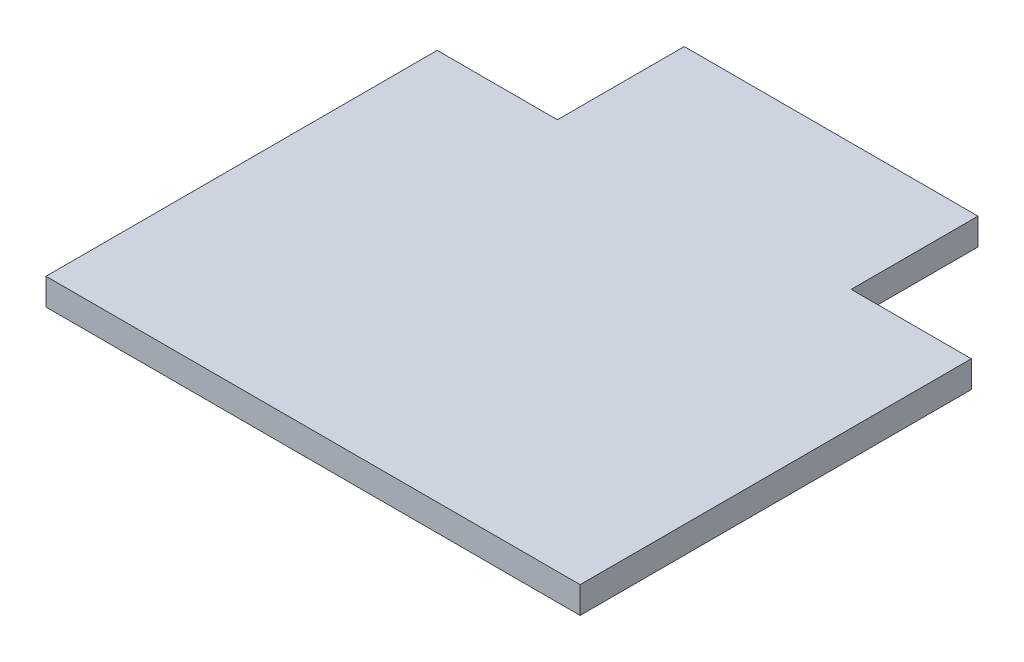
ISO-10303-21;
HEADER;
FILE_DESCRIPTION(('STEP AP214'),'2;1');
FILE_NAME('part.step','',(''),(''),'','','');
FILE_SCHEMA(('AUTOMOTIVE_DESIGN { 1 0 10303 214 1 1 1 1 }'));
ENDSEC;
DATA;
#1=APPLICATION_CONTEXT('core data for automotive mechanical design processes');
#2=APPLICATION_PROTOCOL_DEFINITION('international standard','automotive_design',2000,#1);
#3=PRODUCT_CONTEXT('',#1,'mechanical');
#4=PRODUCT('Part','Part','',(#3));
#5=PRODUCT_RELATED_PRODUCT_CATEGORY('part','',(#4));
#6=PRODUCT_DEFINITION_FORMATION('','',#4);
#7=PRODUCT_DEFINITION_CONTEXT('part definition',#1,'design');
#8=PRODUCT_DEFINITION('design','',#6,#7);
#9=PRODUCT_DEFINITION_SHAPE('','',#8);
#10=(LENGTH_UNIT() NAMED_UNIT(*) SI_UNIT(.MILLI.,.METRE.));
#11=(NAMED_UNIT(*) PLANE_ANGLE_UNIT() SI_UNIT($,.RADIAN.));
#12=(NAMED_UNIT(*) SI_UNIT($,.STERADIAN.) SOLID_ANGLE_UNIT());
#13=UNCERTAINTY_MEASURE_WITH_UNIT(LENGTH_MEASURE(1.E-05),#10,'distance_accuracy_value','');
#14=(GEOMETRIC_REPRESENTATION_CONTEXT(3) GLOBAL_UNCERTAINTY_ASSIGNED_CONTEXT((#13)) GLOBAL_UNIT_ASSIGNED_CONTEXT((#10,
#11,#12)) REPRESENTATION_CONTEXT('',''));
#15=CARTESIAN_POINT('',(0.,0.,0.));
#16=DIRECTION('',(0.,0.,1.));
#17=DIRECTION('',(1.,0.,0.));
#18=AXIS2_PLACEMENT_3D('',#15,#16,#17);
#19=CARTESIAN_POINT('',(9.,2.,0.));
#20=DIRECTION('',(0.,0.,1.));
#21=DIRECTION('',(1.,0.,0.));
#22=AXIS2_PLACEMENT_3D('',#19,#20,#21);
#23=PLANE('',#22);
#24=DIRECTION('',(-1.,0.,0.));
#25=VECTOR('',#24,1.);
#26=CARTESIAN_POINT('',(9.,0.,0.));
#27=LINE('',#26,#25);
#28=CARTESIAN_POINT('',(9.,0.,0.));
#29=VERTEX_POINT('',#28);
#30=CARTESIAN_POINT('',(0.,0.,0.));
#31=VERTEX_POINT('',#30);
#32=EDGE_CURVE('E137',#29,#31,#27,.T.);
#33=ORIENTED_EDGE('',*,*,#32,.T.);
#34=DIRECTION('',(0.,-1.,0.));
#35=VECTOR('',#34,1.);
#36=CARTESIAN_POINT('',(0.,2.,0.));
#37=LINE('',#36,#35);
#38=CARTESIAN_POINT('',(0.,2.,0.));
#39=VERTEX_POINT('',#38);
#40=EDGE_CURVE('E11',#39,#31,#37,.T.);
#41=ORIENTED_EDGE('',*,*,#40,.F.);
#42=DIRECTION('',(-1.,0.,0.));
#43=VECTOR('',#42,1.);
#44=CARTESIAN_POINT('',(9.,2.,0.));
#45=LINE('',#44,#43);
#46=CARTESIAN_POINT('',(9.,2.,0.));
#47=VERTEX_POINT('',#46);
#48=EDGE_CURVE('E151',#47,#39,#45,.T.);
#49=ORIENTED_EDGE('',*,*,#48,.F.);
#50=DIRECTION('',(0.,-1.,0.));
#51=VECTOR('',#50,1.);
#52=CARTESIAN_POINT('',(9.,2.,0.));
#53=LINE('',#52,#51);
#54=EDGE_CURVE('E133',#47,#29,#53,.T.);
#55=ORIENTED_EDGE('',*,*,#54,.T.);
#56=EDGE_LOOP('',(#33,#41,#49,#55));
#57=FACE_BOUND('',#56,.T.);
#58=ADVANCED_FACE('F41',(#57),#23,.F.);
#59=CARTESIAN_POINT('',(0.,2.,0.));
#60=DIRECTION('',(1.,0.,0.));
#61=DIRECTION('',(0.,0.,-1.));
#62=AXIS2_PLACEMENT_3D('',#59,#60,#61);
#63=PLANE('',#62);
#64=DIRECTION('',(0.,0.,1.));
#65=VECTOR('',#64,1.);
#66=CARTESIAN_POINT('',(0.,0.,0.));
#67=LINE('',#66,#65);
#68=CARTESIAN_POINT('',(0.,0.,29.3));
#69=VERTEX_POINT('',#68);
#70=EDGE_CURVE('E140',#31,#69,#67,.T.);
#71=ORIENTED_EDGE('',*,*,#70,.T.);
#72=DIRECTION('',(0.,-1.,0.));
#73=VECTOR('',#72,1.);
#74=CARTESIAN_POINT('',(0.,2.,29.3));
#75=LINE('',#74,#73);
#76=CARTESIAN_POINT('',(0.,2.,29.3));
#77=VERTEX_POINT('',#76);
#78=EDGE_CURVE('E49',#77,#69,#75,.T.);
#79=ORIENTED_EDGE('',*,*,#78,.F.);
#80=DIRECTION('',(0.,0.,1.));
#81=VECTOR('',#80,1.);
#82=CARTESIAN_POINT('',(0.,2.,0.));
#83=LINE('',#82,#81);
#84=EDGE_CURVE('E100',#39,#77,#83,.T.);
#85=ORIENTED_EDGE('',*,*,#84,.F.);
#86=ORIENTED_EDGE('',*,*,#40,.T.);
#87=EDGE_LOOP('',(#71,#79,#85,#86));
#88=FACE_BOUND('',#87,.T.);
#89=ADVANCED_FACE('F186',(#88),#63,.F.);
#90=CARTESIAN_POINT('',(0.,2.,29.3));
#91=DIRECTION('',(0.,0.,-1.));
#92=DIRECTION('',(-1.,0.,0.));
#93=AXIS2_PLACEMENT_3D('',#90,#91,#92);
#94=PLANE('',#93);
#95=DIRECTION('',(1.,0.,0.));
#96=VECTOR('',#95,1.);
#97=CARTESIAN_POINT('',(0.,0.,29.3));
#98=LINE('',#97,#96);
#99=CARTESIAN_POINT('',(40.,0.,29.3));
#100=VERTEX_POINT('',#99);
#101=EDGE_CURVE('E142',#69,#100,#98,.T.);
#102=ORIENTED_EDGE('',*,*,#101,.T.);
#103=DIRECTION('',(0.,-1.,0.));
#104=VECTOR('',#103,1.);
#105=CARTESIAN_POINT('',(40.,2.,29.3));
#106=LINE('',#105,#104);
#107=CARTESIAN_POINT('',(40.,2.,29.3));
#108=VERTEX_POINT('',#107);
#109=EDGE_CURVE('E158',#108,#100,#106,.T.);
#110=ORIENTED_EDGE('',*,*,#109,.F.);
#111=DIRECTION('',(1.,0.,0.));
#112=VECTOR('',#111,1.);
#113=CARTESIAN_POINT('',(0.,2.,29.3));
#114=LINE('',#113,#112);
#115=EDGE_CURVE('E166',#77,#108,#114,.T.);
#116=ORIENTED_EDGE('',*,*,#115,.F.);
#117=ORIENTED_EDGE('',*,*,#78,.T.);
#118=EDGE_LOOP('',(#102,#110,#116,#117));
#119=FACE_BOUND('',#118,.T.);
#120=ADVANCED_FACE('F164',(#119),#94,.F.);
#121=CARTESIAN_POINT('',(40.,2.,29.3));
#122=DIRECTION('',(-1.,0.,0.));
#123=DIRECTION('',(0.,0.,1.));
#124=AXIS2_PLACEMENT_3D('',#121,#122,#123);
#125=PLANE('',#124);
#126=DIRECTION('',(0.,0.,-1.));
#127=VECTOR('',#126,1.);
#128=CARTESIAN_POINT('',(40.,0.,29.3));
#129=LINE('',#128,#127);
#130=CARTESIAN_POINT('',(40.,0.,0.));
#131=VERTEX_POINT('',#130);
#132=EDGE_CURVE('E144',#100,#131,#129,.T.);
#133=ORIENTED_EDGE('',*,*,#132,.T.);
#134=DIRECTION('',(0.,-1.,0.));
#135=VECTOR('',#134,1.);
#136=CARTESIAN_POINT('',(40.,2.,0.));
#137=LINE('',#136,#135);
#138=CARTESIAN_POINT('',(40.,2.,0.));
#139=VERTEX_POINT('',#138);
#140=EDGE_CURVE('E155',#139,#131,#137,.T.);
#141=ORIENTED_EDGE('',*,*,#140,.F.);
#142=DIRECTION('',(0.,0.,-1.));
#143=VECTOR('',#142,1.);
#144=CARTESIAN_POINT('',(40.,2.,29.3));
#145=LINE('',#144,#143);
#146=EDGE_CURVE('E178',#108,#139,#145,.T.);
#147=ORIENTED_EDGE('',*,*,#146,.F.);
#148=ORIENTED_EDGE('',*,*,#109,.T.);
#149=EDGE_LOOP('',(#133,#141,#147,#148));
#150=FACE_BOUND('',#149,.T.);
#151=ADVANCED_FACE('F174',(#150),#125,.F.);
#152=CARTESIAN_POINT('',(40.,2.,0.));
#153=DIRECTION('',(0.,0.,1.));
#154=DIRECTION('',(1.,0.,0.));
#155=AXIS2_PLACEMENT_3D('',#152,#153,#154);
#156=PLANE('',#155);
#157=DIRECTION('',(-1.,0.,0.));
#158=VECTOR('',#157,1.);
#159=CARTESIAN_POINT('',(40.,0.,0.));
#160=LINE('',#159,#158);
#161=CARTESIAN_POINT('',(31.,0.,0.));
#162=VERTEX_POINT('',#161);
#163=EDGE_CURVE('E146',#131,#162,#160,.T.);
#164=ORIENTED_EDGE('',*,*,#163,.T.);
#165=DIRECTION('',(0.,-1.,0.));
#166=VECTOR('',#165,1.);
#167=CARTESIAN_POINT('',(31.,2.,0.));
#168=LINE('',#167,#166);
#169=CARTESIAN_POINT('',(31.,2.,0.));
#170=VERTEX_POINT('',#169);
#171=EDGE_CURVE('E128',#170,#162,#168,.T.);
#172=ORIENTED_EDGE('',*,*,#171,.F.);
#173=DIRECTION('',(-1.,0.,0.));
#174=VECTOR('',#173,1.);
#175=CARTESIAN_POINT('',(40.,2.,0.));
#176=LINE('',#175,#174);
#177=EDGE_CURVE('E119',#139,#170,#176,.T.);
#178=ORIENTED_EDGE('',*,*,#177,.F.);
#179=ORIENTED_EDGE('',*,*,#140,.T.);
#180=EDGE_LOOP('',(#164,#172,#178,#179));
#181=FACE_BOUND('',#180,.T.);
#182=ADVANCED_FACE('F177',(#181),#156,.F.);
#183=CARTESIAN_POINT('',(31.,2.,0.));
#184=DIRECTION('',(-1.,0.,0.));
#185=DIRECTION('',(0.,0.,1.));
#186=AXIS2_PLACEMENT_3D('',#183,#184,#185);
#187=PLANE('',#186);
#188=DIRECTION('',(0.,0.,-1.));
#189=VECTOR('',#188,1.);
#190=CARTESIAN_POINT('',(31.,0.,0.));
#191=LINE('',#190,#189);
#192=CARTESIAN_POINT('',(31.,0.,-9.5));
#193=VERTEX_POINT('',#192);
#194=EDGE_CURVE('E127',#162,#193,#191,.T.);
#195=ORIENTED_EDGE('',*,*,#194,.T.);
#196=DIRECTION('',(0.,-1.,0.));
#197=VECTOR('',#196,1.);
#198=CARTESIAN_POINT('',(31.,2.,-9.5));
#199=LINE('',#198,#197);
#200=CARTESIAN_POINT('',(31.,2.,-9.5));
#201=VERTEX_POINT('',#200);
#202=EDGE_CURVE('E124',#201,#193,#199,.T.);
#203=ORIENTED_EDGE('',*,*,#202,.F.);
#204=DIRECTION('',(0.,0.,-1.));
#205=VECTOR('',#204,1.);
#206=CARTESIAN_POINT('',(31.,2.,0.));
#207=LINE('',#206,#205);
#208=EDGE_CURVE('E113',#170,#201,#207,.T.);
#209=ORIENTED_EDGE('',*,*,#208,.F.);
#210=ORIENTED_EDGE('',*,*,#171,.T.);
#211=EDGE_LOOP('',(#195,#203,#209,#210));
#212=FACE_BOUND('',#211,.T.);
#213=ADVANCED_FACE('F125',(#212),#187,.F.);
#214=CARTESIAN_POINT('',(31.,2.,-9.5));
#215=DIRECTION('',(0.,0.,1.));
#216=DIRECTION('',(1.,0.,0.));
#217=AXIS2_PLACEMENT_3D('',#214,#215,#216);
#218=PLANE('',#217);
#219=DIRECTION('',(-1.,0.,0.));
#220=VECTOR('',#219,1.);
#221=CARTESIAN_POINT('',(31.,0.,-9.5));
#222=LINE('',#221,#220);
#223=CARTESIAN_POINT('',(9.,0.,-9.5));
#224=VERTEX_POINT('',#223);
#225=EDGE_CURVE('E86',#193,#224,#222,.T.);
#226=ORIENTED_EDGE('',*,*,#225,.T.);
#227=DIRECTION('',(0.,-1.,0.));
#228=VECTOR('',#227,1.);
#229=CARTESIAN_POINT('',(9.,2.,-9.5));
#230=LINE('',#229,#228);
#231=CARTESIAN_POINT('',(9.,2.,-9.5));
#232=VERTEX_POINT('',#231);
#233=EDGE_CURVE('E129',#232,#224,#230,.T.);
#234=ORIENTED_EDGE('',*,*,#233,.F.);
#235=DIRECTION('',(-1.,0.,0.));
#236=VECTOR('',#235,1.);
#237=CARTESIAN_POINT('',(31.,2.,-9.5));
#238=LINE('',#237,#236);
#239=EDGE_CURVE('E117',#201,#232,#238,.T.);
#240=ORIENTED_EDGE('',*,*,#239,.F.);
#241=ORIENTED_EDGE('',*,*,#202,.T.);
#242=EDGE_LOOP('',(#226,#234,#240,#241));
#243=FACE_BOUND('',#242,.T.);
#244=ADVANCED_FACE('F131',(#243),#218,.F.);
#245=CARTESIAN_POINT('',(9.,2.,-9.5));
#246=DIRECTION('',(1.,0.,0.));
#247=DIRECTION('',(0.,0.,-1.));
#248=AXIS2_PLACEMENT_3D('',#245,#246,#247);
#249=PLANE('',#248);
#250=DIRECTION('',(0.,0.,1.));
#251=VECTOR('',#250,1.);
#252=CARTESIAN_POINT('',(9.,0.,-9.5));
#253=LINE('',#252,#251);
#254=EDGE_CURVE('E92',#224,#29,#253,.T.);
#255=ORIENTED_EDGE('',*,*,#254,.T.);
#256=ORIENTED_EDGE('',*,*,#54,.F.);
#257=DIRECTION('',(0.,0.,1.));
#258=VECTOR('',#257,1.);
#259=CARTESIAN_POINT('',(9.,2.,-9.5));
#260=LINE('',#259,#258);
#261=EDGE_CURVE('E57',#232,#47,#260,.T.);
#262=ORIENTED_EDGE('',*,*,#261,.F.);
#263=ORIENTED_EDGE('',*,*,#233,.T.);
#264=EDGE_LOOP('',(#255,#256,#262,#263));
#265=FACE_BOUND('',#264,.T.);
#266=ADVANCED_FACE('F202',(#265),#249,.F.);
#267=CARTESIAN_POINT('',(0.,2.,0.));
#268=DIRECTION('',(0.,1.,0.));
#269=DIRECTION('',(0.,0.,1.));
#270=AXIS2_PLACEMENT_3D('',#267,#268,#269);
#271=PLANE('',#270);
#272=ORIENTED_EDGE('',*,*,#48,.T.);
#273=ORIENTED_EDGE('',*,*,#84,.T.);
#274=ORIENTED_EDGE('',*,*,#115,.T.);
#275=ORIENTED_EDGE('',*,*,#146,.T.);
#276=ORIENTED_EDGE('',*,*,#177,.T.);
#277=ORIENTED_EDGE('',*,*,#208,.T.);
#278=ORIENTED_EDGE('',*,*,#239,.T.);
#279=ORIENTED_EDGE('',*,*,#261,.T.);
#280=EDGE_LOOP('',(#272,#273,#274,#275,#276,#277,#278,#279));
#281=FACE_BOUND('',#280,.T.);
#282=ADVANCED_FACE('F115',(#281),#271,.T.);
#283=CARTESIAN_POINT('',(0.,0.,0.));
#284=DIRECTION('',(0.,1.,0.));
#285=DIRECTION('',(0.,0.,1.));
#286=AXIS2_PLACEMENT_3D('',#283,#284,#285);
#287=PLANE('',#286);
#288=ORIENTED_EDGE('',*,*,#32,.F.);
#289=ORIENTED_EDGE('',*,*,#254,.F.);
#290=ORIENTED_EDGE('',*,*,#225,.F.);
#291=ORIENTED_EDGE('',*,*,#194,.F.);
#292=ORIENTED_EDGE('',*,*,#163,.F.);
#293=ORIENTED_EDGE('',*,*,#132,.F.);
#294=ORIENTED_EDGE('',*,*,#101,.F.);
#295=ORIENTED_EDGE('',*,*,#70,.F.);
#296=EDGE_LOOP('',(#288,#289,#290,#291,#292,#293,#294,#295));
#297=FACE_BOUND('',#296,.T.);
#298=ADVANCED_FACE('F170',(#297),#287,.F.);
#299=CLOSED_SHELL('',(#58,#89,#120,#151,#182,#213,#244,#266,#282,#298));
#300=MANIFOLD_SOLID_BREP('B2',#299);
#301=ADVANCED_BREP_SHAPE_REPRESENTATION('',(#18,#300),#14);
#302=SHAPE_DEFINITION_REPRESENTATION(#9,#301);
ENDSEC;
END-ISO-10303-21;
